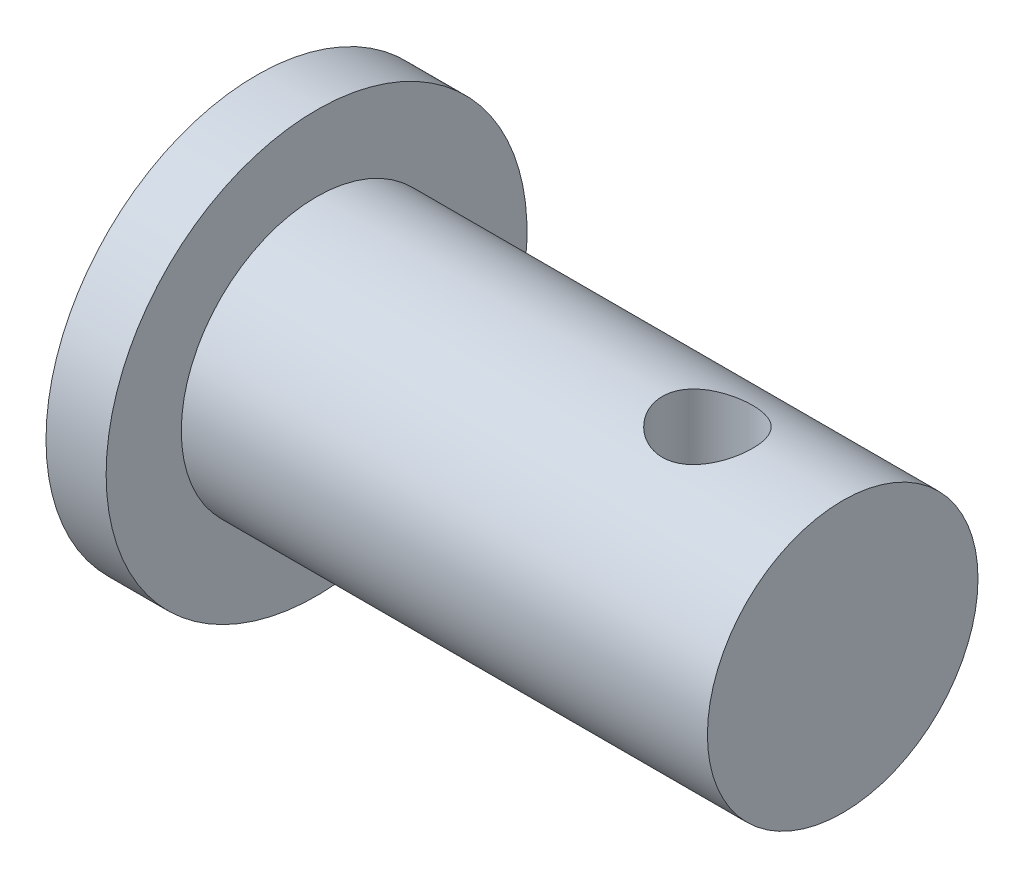
ISO-10303-21;
HEADER;
FILE_DESCRIPTION(('STEP AP214'),'2;1');
FILE_NAME('part.step','',(''),(''),'','','');
FILE_SCHEMA(('AUTOMOTIVE_DESIGN { 1 0 10303 214 1 1 1 1 }'));
ENDSEC;
DATA;
#1=APPLICATION_CONTEXT('core data for automotive mechanical design processes');
#2=APPLICATION_PROTOCOL_DEFINITION('international standard','automotive_design',2000,#1);
#3=PRODUCT_CONTEXT('',#1,'mechanical');
#4=PRODUCT('Part','Part','',(#3));
#5=PRODUCT_RELATED_PRODUCT_CATEGORY('part','',(#4));
#6=PRODUCT_DEFINITION_FORMATION('','',#4);
#7=PRODUCT_DEFINITION_CONTEXT('part definition',#1,'design');
#8=PRODUCT_DEFINITION('design','',#6,#7);
#9=PRODUCT_DEFINITION_SHAPE('','',#8);
#10=(LENGTH_UNIT() NAMED_UNIT(*) SI_UNIT(.MILLI.,.METRE.));
#11=(NAMED_UNIT(*) PLANE_ANGLE_UNIT() SI_UNIT($,.RADIAN.));
#12=(NAMED_UNIT(*) SI_UNIT($,.STERADIAN.) SOLID_ANGLE_UNIT());
#13=UNCERTAINTY_MEASURE_WITH_UNIT(LENGTH_MEASURE(1.E-05),#10,'distance_accuracy_value','');
#14=(GEOMETRIC_REPRESENTATION_CONTEXT(3) GLOBAL_UNCERTAINTY_ASSIGNED_CONTEXT((#13)) GLOBAL_UNIT_ASSIGNED_CONTEXT((#10,
#11,#12)) REPRESENTATION_CONTEXT('',''));
#15=CARTESIAN_POINT('',(0.,0.,0.));
#16=DIRECTION('',(0.,0.,1.));
#17=DIRECTION('',(1.,0.,0.));
#18=AXIS2_PLACEMENT_3D('',#15,#16,#17);
#19=CARTESIAN_POINT('',(19.5,0.,0.));
#20=DIRECTION('',(-1.,0.,0.));
#21=DIRECTION('',(0.,0.,1.));
#22=AXIS2_PLACEMENT_3D('',#19,#20,#21);
#23=CYLINDRICAL_SURFACE('',#22,4.5);
#24=CARTESIAN_POINT('',(15.,-4.24264068711929,1.5));
#25=CARTESIAN_POINT('',(15.0817022622541,-4.24264041795651,1.50000038692157));
#26=CARTESIAN_POINT('',(15.1634021997354,-4.24502653936286,1.49330217552828));
#27=CARTESIAN_POINT('',(15.3243816314914,-4.25426361121882,1.46677669753321));
#28=CARTESIAN_POINT('',(15.4036607248087,-4.26111529713283,1.4469472682526));
#29=CARTESIAN_POINT('',(15.5574403394959,-4.27842305533187,1.39493322852736));
#30=CARTESIAN_POINT('',(15.6319498941641,-4.28887205956983,1.36277283210487));
#31=CARTESIAN_POINT('',(15.7745400728219,-4.31218683015487,1.28709244266207));
#32=CARTESIAN_POINT('',(15.8426192738304,-4.32505312955418,1.24356994329028));
#33=CARTESIAN_POINT('',(15.9730799435075,-4.3523173411121,1.14457671966432));
#34=CARTESIAN_POINT('',(16.0351731430076,-4.36675342266966,1.08873651206688));
#35=CARTESIAN_POINT('',(16.149310201837,-4.39520797201504,0.967481500821592));
#36=CARTESIAN_POINT('',(16.2013524473736,-4.40922637243442,0.902065162578563));
#37=CARTESIAN_POINT('',(16.2952183459944,-4.43570800382699,0.761406761947514));
#38=CARTESIAN_POINT('',(16.3367399559269,-4.44812111552408,0.685952866836787));
#39=CARTESIAN_POINT('',(16.4063873776913,-4.46954380156474,0.528646834481211));
#40=CARTESIAN_POINT('',(16.4345167997654,-4.47855429304502,0.446796428530818));
#41=CARTESIAN_POINT('',(16.4756037819486,-4.49188613147861,0.282043226150241));
#42=CARTESIAN_POINT('',(16.4890551693855,-4.49635972166341,0.199276132279451));
#43=CARTESIAN_POINT('',(16.501974440041,-4.5006541232737,0.0325468122361353));
#44=CARTESIAN_POINT('',(16.5014459274786,-4.50047613394336,-0.0514151003158403));
#45=CARTESIAN_POINT('',(16.486733618151,-4.49559059428104,-0.214655272790726));
#46=CARTESIAN_POINT('',(16.4730862072882,-4.49106097132703,-0.293988072887501));
#47=CARTESIAN_POINT('',(16.4334105285293,-4.47820451009571,-0.449165158233241));
#48=CARTESIAN_POINT('',(16.4073814215304,-4.46987741446672,-0.525009206668763));
#49=CARTESIAN_POINT('',(16.3433680240408,-4.45013505439938,-0.67222871226302));
#50=CARTESIAN_POINT('',(16.3052310921798,-4.43868063786404,-0.743532331453497));
#51=CARTESIAN_POINT('',(16.2182104418274,-4.41387589557998,-0.878886488290754));
#52=CARTESIAN_POINT('',(16.16932373501,-4.40052504300777,-0.942935001577154));
#53=CARTESIAN_POINT('',(16.0594884098089,-4.37259287776335,-1.06515129982786));
#54=CARTESIAN_POINT('',(15.9980802632318,-4.35798322759,-1.12290023560133));
#55=CARTESIAN_POINT('',(15.866326911416,-4.32971002867667,-1.22741588939383));
#56=CARTESIAN_POINT('',(15.7959803314301,-4.31604662597175,-1.27418091490951));
#57=CARTESIAN_POINT('',(15.6470195615769,-4.29105787703296,-1.3559811825641));
#58=CARTESIAN_POINT('',(15.5683018029483,-4.27976864008232,-1.39083969547657));
#59=CARTESIAN_POINT('',(15.4056429086006,-4.26122476317448,-1.44666478994926));
#60=CARTESIAN_POINT('',(15.3217039781673,-4.25396843251835,-1.4676371936333));
#61=CARTESIAN_POINT('',(15.1550424668991,-4.24469454453105,-1.49424192313571));
#62=CARTESIAN_POINT('',(15.0724358628814,-4.24245540472709,-1.50052364325862));
#63=CARTESIAN_POINT('',(14.9073357763244,-4.24285008094201,-1.49940815836741));
#64=CARTESIAN_POINT('',(14.8248422759629,-4.24548301189152,-1.49201343784089));
#65=CARTESIAN_POINT('',(14.6652645514333,-4.25510427134068,-1.46433847732775));
#66=CARTESIAN_POINT('',(14.588091854774,-4.2619398816089,-1.44450959097083));
#67=CARTESIAN_POINT('',(14.4381845906409,-4.27902830506905,-1.39307079384089));
#68=CARTESIAN_POINT('',(14.3654508126137,-4.2892817240236,-1.36145879454519));
#69=CARTESIAN_POINT('',(14.2239293687296,-4.31245316393576,-1.28621151110835));
#70=CARTESIAN_POINT('',(14.1553400360373,-4.32544538498415,-1.24222667753773));
#71=CARTESIAN_POINT('',(14.0262809214244,-4.35248653096476,-1.14387844583635));
#72=CARTESIAN_POINT('',(13.9658135420082,-4.36653576665699,-1.08951198824818));
#73=CARTESIAN_POINT('',(13.851708023864,-4.39492557956765,-0.968837558850486));
#74=CARTESIAN_POINT('',(13.7985384149717,-4.40924765366843,-0.90208090581998));
#75=CARTESIAN_POINT('',(13.7041257864779,-4.43590277419665,-0.760240937100389));
#76=CARTESIAN_POINT('',(13.6628823432564,-4.44823589126543,-0.685157917296831));
#77=CARTESIAN_POINT('',(13.5938698427074,-4.46946608715904,-0.529169793648445));
#78=CARTESIAN_POINT('',(13.5660130842779,-4.47838545006797,-0.448306684981796));
#79=CARTESIAN_POINT('',(13.5244083869098,-4.49187916256662,-0.282687698769026));
#80=CARTESIAN_POINT('',(13.5106553551792,-4.49645508051028,-0.197933237930836));
#81=CARTESIAN_POINT('',(13.4981068835915,-4.50062794854384,-0.0312230037900626));
#82=CARTESIAN_POINT('',(13.4986388191014,-4.50044880134159,0.0506770858800268));
#83=CARTESIAN_POINT('',(13.5129859622196,-4.49568294779097,0.21316671750026));
#84=CARTESIAN_POINT('',(13.5268000922292,-4.49109659900364,0.293756365228584));
#85=CARTESIAN_POINT('',(13.5668733518639,-4.47811372431619,0.450063179148087));
#86=CARTESIAN_POINT('',(13.5929313230294,-4.46977887541723,0.525837406369183));
#87=CARTESIAN_POINT('',(13.6565662966457,-4.45015741056742,0.671967526409693));
#88=CARTESIAN_POINT('',(13.6941453827955,-4.43887026072025,0.742322436213648));
#89=CARTESIAN_POINT('',(13.781354268153,-4.41398803241821,0.878451024463177));
#90=CARTESIAN_POINT('',(13.8313780280725,-4.4003230873789,0.943959377336411));
#91=CARTESIAN_POINT('',(13.9413860867343,-4.37239483187819,1.06587153940864));
#92=CARTESIAN_POINT('',(14.0013735633941,-4.35813133159646,1.12227243243689));
#93=CARTESIAN_POINT('',(14.1324140333804,-4.32994919738397,1.22661271324968));
#94=CARTESIAN_POINT('',(14.203808266465,-4.31606591982946,1.27413444899685));
#95=CARTESIAN_POINT('',(14.3540016403542,-4.29090289984523,1.35647151495167));
#96=CARTESIAN_POINT('',(14.4327988395445,-4.27962247741874,1.39129016522921));
#97=CARTESIAN_POINT('',(14.5919427360234,-4.26152001309772,1.44576574230625));
#98=CARTESIAN_POINT('',(14.672058395288,-4.25451949285773,1.46603686372428));
#99=CARTESIAN_POINT('',(14.8347840757001,-4.24508075309277,1.4931514802239));
#100=CARTESIAN_POINT('',(14.9173932261161,-4.24264095926192,1.49999960879489));
#101=CARTESIAN_POINT('',(15.,-4.24264068711929,1.5));
#102=B_SPLINE_CURVE_WITH_KNOTS('',3,(#24,#25,#26,#27,#28,#29,#30,#31,#32,#33,#34,#35,#36,#37,
#38,#39,#40,#41,#42,#43,#44,#45,#46,#47,#48,#49,#50,#51,#52,#53,#54,#55,#56,#57,#58,#59,#60,#61,
#62,#63,#64,#65,#66,#67,#68,#69,#70,#71,#72,#73,#74,#75,#76,#77,#78,#79,#80,#81,#82,#83,#84,#85,
#86,#87,#88,#89,#90,#91,#92,#93,#94,#95,#96,#97,#98,#99,#100,#101),.UNSPECIFIED.,.T.,.F.,(4,2,2,
2,2,2,2,2,2,2,2,2,2,2,2,2,2,2,2,2,2,2,2,2,2,2,2,2,2,2,2,2,2,2,2,2,2,2,4),(0.,0.244800877199033,
0.489642082522746,0.73400494125124,0.978421749278162,1.23152006141352,1.48465897757982,
1.74440259215486,2.00407614580184,2.25471478147401,2.50528879953491,2.74603507238354,
2.98679766283855,3.23072482290502,3.47471987811033,3.73020261545876,3.98572469418159,
4.24488959763007,4.50394577031476,4.75131437043211,4.99863803752403,5.23746593649716,
5.47633618716971,5.72278286600124,5.96930228489743,6.22768212253191,6.4860527813285,
6.74270686782829,6.99926824502787,7.24377127013005,7.48825446011223,7.72885434057197,
7.96949776141416,8.21903279277503,8.46864756645499,8.72803354100769,8.98735167396852,
9.23494818240588,9.48245920782248),.UNSPECIFIED.);
#103=CARTESIAN_POINT('',(15.,-4.24264068711929,1.5));
#104=VERTEX_POINT('',#103);
#105=EDGE_CURVE('E50',#104,#104,#102,.T.);
#106=ORIENTED_EDGE('',*,*,#105,.T.);
#107=EDGE_LOOP('',(#106));
#108=FACE_BOUND('',#107,.T.);
#109=CARTESIAN_POINT('',(15.,4.24264068711929,1.5));
#110=CARTESIAN_POINT('',(14.9182977377459,4.24264041795651,1.50000038692157));
#111=CARTESIAN_POINT('',(14.8365978002646,4.24502653936286,1.49330217552828));
#112=CARTESIAN_POINT('',(14.6756183685086,4.25426361121882,1.46677669753321));
#113=CARTESIAN_POINT('',(14.5963392751913,4.26111529713283,1.4469472682526));
#114=CARTESIAN_POINT('',(14.4425596605041,4.27842305533187,1.39493322852736));
#115=CARTESIAN_POINT('',(14.3680501058359,4.28887205956983,1.36277283210487));
#116=CARTESIAN_POINT('',(14.2254599271781,4.31218683015487,1.28709244266207));
#117=CARTESIAN_POINT('',(14.1573807261696,4.32505312955419,1.24356994329027));
#118=CARTESIAN_POINT('',(14.0269200564925,4.3523173411121,1.14457671966432));
#119=CARTESIAN_POINT('',(13.9648268569924,4.36675342266966,1.08873651206688));
#120=CARTESIAN_POINT('',(13.850689798163,4.39520797201505,0.967481500821592));
#121=CARTESIAN_POINT('',(13.7986475526264,4.40922637243442,0.902065162578563));
#122=CARTESIAN_POINT('',(13.7047816540056,4.43570800382699,0.761406761947515));
#123=CARTESIAN_POINT('',(13.6632600440731,4.44812111552408,0.685952866836787));
#124=CARTESIAN_POINT('',(13.5936126223087,4.46954380156474,0.52864683448121));
#125=CARTESIAN_POINT('',(13.5654832002346,4.47855429304502,0.446796428530818));
#126=CARTESIAN_POINT('',(13.5243962180514,4.49188613147861,0.282043226150241));
#127=CARTESIAN_POINT('',(13.5109448306145,4.49635972166341,0.199276132279451));
#128=CARTESIAN_POINT('',(13.498025559959,4.5006541232737,0.0325468122361353));
#129=CARTESIAN_POINT('',(13.4985540725214,4.50047613394336,-0.0514151003158401));
#130=CARTESIAN_POINT('',(13.513266381849,4.49559059428104,-0.214655272790727));
#131=CARTESIAN_POINT('',(13.5269137927118,4.49106097132703,-0.293988072887502));
#132=CARTESIAN_POINT('',(13.5665894714707,4.47820451009571,-0.449165158233242));
#133=CARTESIAN_POINT('',(13.5926185784696,4.46987741446672,-0.525009206668764));
#134=CARTESIAN_POINT('',(13.6566319759592,4.45013505439938,-0.672228712263021));
#135=CARTESIAN_POINT('',(13.6947689078202,4.43868063786404,-0.743532331453498));
#136=CARTESIAN_POINT('',(13.7817895581726,4.41387589557997,-0.878886488290755));
#137=CARTESIAN_POINT('',(13.83067626499,4.40052504300777,-0.942935001577155));
#138=CARTESIAN_POINT('',(13.9405115901911,4.37259287776335,-1.06515129982786));
#139=CARTESIAN_POINT('',(14.0019197367682,4.35798322759,-1.12290023560133));
#140=CARTESIAN_POINT('',(14.133673088584,4.32971002867667,-1.22741588939383));
#141=CARTESIAN_POINT('',(14.2040196685699,4.31604662597175,-1.27418091490951));
#142=CARTESIAN_POINT('',(14.3529804384231,4.29105787703296,-1.3559811825641));
#143=CARTESIAN_POINT('',(14.4316981970517,4.27976864008232,-1.39083969547657));
#144=CARTESIAN_POINT('',(14.5943570913994,4.26122476317448,-1.44666478994926));
#145=CARTESIAN_POINT('',(14.6782960218327,4.25396843251835,-1.4676371936333));
#146=CARTESIAN_POINT('',(14.8449575331009,4.24469454453105,-1.49424192313571));
#147=CARTESIAN_POINT('',(14.9275641371186,4.24245540472709,-1.50052364325862));
#148=CARTESIAN_POINT('',(15.0926642236756,4.24285008094201,-1.49940815836741));
#149=CARTESIAN_POINT('',(15.1751577240371,4.24548301189152,-1.49201343784089));
#150=CARTESIAN_POINT('',(15.3347354485667,4.25510427134068,-1.46433847732775));
#151=CARTESIAN_POINT('',(15.411908145226,4.2619398816089,-1.44450959097083));
#152=CARTESIAN_POINT('',(15.5618154093591,4.27902830506905,-1.39307079384089));
#153=CARTESIAN_POINT('',(15.6345491873863,4.2892817240236,-1.36145879454519));
#154=CARTESIAN_POINT('',(15.7760706312704,4.31245316393576,-1.28621151110835));
#155=CARTESIAN_POINT('',(15.8446599639627,4.32544538498415,-1.24222667753773));
#156=CARTESIAN_POINT('',(15.9737190785756,4.35248653096476,-1.14387844583635));
#157=CARTESIAN_POINT('',(16.0341864579918,4.36653576665699,-1.08951198824818));
#158=CARTESIAN_POINT('',(16.1482919761359,4.39492557956765,-0.968837558850486));
#159=CARTESIAN_POINT('',(16.2014615850283,4.40924765366843,-0.902080905819979));
#160=CARTESIAN_POINT('',(16.2958742135221,4.43590277419665,-0.760240937100388));
#161=CARTESIAN_POINT('',(16.3371176567436,4.44823589126543,-0.68515791729683));
#162=CARTESIAN_POINT('',(16.4061301572926,4.46946608715904,-0.529169793648443));
#163=CARTESIAN_POINT('',(16.4339869157221,4.47838545006797,-0.448306684981795));
#164=CARTESIAN_POINT('',(16.4755916130902,4.49187916256662,-0.282687698769025));
#165=CARTESIAN_POINT('',(16.4893446448208,4.49645508051028,-0.197933237930834));
#166=CARTESIAN_POINT('',(16.5018931164085,4.50062794854384,-0.0312230037900615));
#167=CARTESIAN_POINT('',(16.5013611808986,4.50044880134159,0.0506770858800275));
#168=CARTESIAN_POINT('',(16.4870140377804,4.49568294779097,0.21316671750026));
#169=CARTESIAN_POINT('',(16.4731999077708,4.49109659900364,0.293756365228585));
#170=CARTESIAN_POINT('',(16.4331266481361,4.47811372431619,0.450063179148088));
#171=CARTESIAN_POINT('',(16.4070686769706,4.46977887541723,0.525837406369184));
#172=CARTESIAN_POINT('',(16.3434337033543,4.45015741056742,0.671967526409693));
#173=CARTESIAN_POINT('',(16.3058546172045,4.43887026072025,0.742322436213648));
#174=CARTESIAN_POINT('',(16.218645731847,4.41398803241821,0.878451024463178));
#175=CARTESIAN_POINT('',(16.1686219719275,4.4003230873789,0.943959377336412));
#176=CARTESIAN_POINT('',(16.0586139132657,4.37239483187819,1.06587153940864));
#177=CARTESIAN_POINT('',(15.9986264366059,4.35813133159646,1.12227243243689));
#178=CARTESIAN_POINT('',(15.8675859666196,4.32994919738397,1.22661271324968));
#179=CARTESIAN_POINT('',(15.796191733535,4.31606591982946,1.27413444899685));
#180=CARTESIAN_POINT('',(15.6459983596458,4.29090289984523,1.35647151495167));
#181=CARTESIAN_POINT('',(15.5672011604555,4.27962247741874,1.39129016522921));
#182=CARTESIAN_POINT('',(15.4080572639766,4.26152001309772,1.44576574230625));
#183=CARTESIAN_POINT('',(15.327941604712,4.25451949285773,1.46603686372428));
#184=CARTESIAN_POINT('',(15.1652159242999,4.24508075309277,1.4931514802239));
#185=CARTESIAN_POINT('',(15.0826067738839,4.24264095926192,1.49999960879489));
#186=CARTESIAN_POINT('',(15.,4.24264068711929,1.5));
#187=B_SPLINE_CURVE_WITH_KNOTS('',3,(#109,#110,#111,#112,#113,#114,#115,#116,#117,#118,#119,
#120,#121,#122,#123,#124,#125,#126,#127,#128,#129,#130,#131,#132,#133,#134,#135,#136,#137,#138,
#139,#140,#141,#142,#143,#144,#145,#146,#147,#148,#149,#150,#151,#152,#153,#154,#155,#156,#157,
#158,#159,#160,#161,#162,#163,#164,#165,#166,#167,#168,#169,#170,#171,#172,#173,#174,#175,#176,
#177,#178,#179,#180,#181,#182,#183,#184,#185,#186),.UNSPECIFIED.,.T.,.F.,(4,2,2,2,2,2,2,2,2,2,2,
2,2,2,2,2,2,2,2,2,2,2,2,2,2,2,2,2,2,2,2,2,2,2,2,2,2,2,4),(0.,0.244800877199035,
0.489642082522746,0.734004941251243,0.978421749278165,1.23152006141352,1.48465897757982,
1.74440259215486,2.00407614580184,2.25471478147401,2.50528879953491,2.74603507238354,
2.98679766283855,3.23072482290503,3.47471987811033,3.73020261545876,3.98572469418159,
4.24488959763007,4.50394577031476,4.75131437043211,4.99863803752403,5.23746593649716,
5.47633618716971,5.72278286600124,5.96930228489743,6.22768212253191,6.48605278132851,
6.74270686782829,6.99926824502787,7.24377127013005,7.48825446011224,7.72885434057197,
7.96949776141416,8.21903279277503,8.46864756645499,8.72803354100769,8.98735167396852,
9.23494818240588,9.48245920782248),.UNSPECIFIED.);
#188=CARTESIAN_POINT('',(15.,4.24264068711929,1.5));
#189=VERTEX_POINT('',#188);
#190=EDGE_CURVE('E65',#189,#189,#187,.T.);
#191=ORIENTED_EDGE('',*,*,#190,.T.);
#192=EDGE_LOOP('',(#191));
#193=FACE_BOUND('',#192,.T.);
#194=CARTESIAN_POINT('',(19.5,0.,0.));
#195=DIRECTION('',(1.,0.,0.));
#196=DIRECTION('',(0.,0.,-1.));
#197=AXIS2_PLACEMENT_3D('',#194,#195,#196);
#198=CIRCLE('',#197,4.5);
#199=CARTESIAN_POINT('',(19.5,0.,-4.5));
#200=VERTEX_POINT('',#199);
#201=EDGE_CURVE('E57',#200,#200,#198,.T.);
#202=ORIENTED_EDGE('',*,*,#201,.F.);
#203=EDGE_LOOP('',(#202));
#204=FACE_BOUND('',#203,.T.);
#205=CARTESIAN_POINT('',(2.,0.,0.));
#206=DIRECTION('',(-1.,0.,0.));
#207=DIRECTION('',(0.,0.,1.));
#208=AXIS2_PLACEMENT_3D('',#205,#206,#207);
#209=CIRCLE('',#208,4.5);
#210=CARTESIAN_POINT('',(2.,0.,4.5));
#211=VERTEX_POINT('',#210);
#212=EDGE_CURVE('E12',#211,#211,#209,.T.);
#213=ORIENTED_EDGE('',*,*,#212,.F.);
#214=EDGE_LOOP('',(#213));
#215=FACE_BOUND('',#214,.T.);
#216=ADVANCED_FACE('F46',(#108,#193,#204,#215),#23,.T.);
#217=CARTESIAN_POINT('',(19.5,0.,0.));
#218=DIRECTION('',(1.,0.,0.));
#219=DIRECTION('',(0.,0.,-1.));
#220=AXIS2_PLACEMENT_3D('',#217,#218,#219);
#221=PLANE('',#220);
#222=ORIENTED_EDGE('',*,*,#201,.T.);
#223=EDGE_LOOP('',(#222));
#224=FACE_BOUND('',#223,.T.);
#225=ADVANCED_FACE('F82',(#224),#221,.T.);
#226=CARTESIAN_POINT('',(2.,0.,0.));
#227=DIRECTION('',(-1.,0.,0.));
#228=DIRECTION('',(0.,0.,1.));
#229=AXIS2_PLACEMENT_3D('',#226,#227,#228);
#230=CYLINDRICAL_SURFACE('',#229,7.);
#231=CARTESIAN_POINT('',(2.,0.,0.));
#232=DIRECTION('',(-1.,0.,0.));
#233=DIRECTION('',(0.,0.,1.));
#234=AXIS2_PLACEMENT_3D('',#231,#232,#233);
#235=CIRCLE('',#234,7.);
#236=CARTESIAN_POINT('',(2.,0.,7.));
#237=VERTEX_POINT('',#236);
#238=EDGE_CURVE('E62',#237,#237,#235,.T.);
#239=ORIENTED_EDGE('',*,*,#238,.T.);
#240=EDGE_LOOP('',(#239));
#241=FACE_BOUND('',#240,.T.);
#242=CARTESIAN_POINT('',(0.,0.,0.));
#243=DIRECTION('',(-1.,0.,0.));
#244=DIRECTION('',(0.,0.,1.));
#245=AXIS2_PLACEMENT_3D('',#242,#243,#244);
#246=CIRCLE('',#245,7.);
#247=CARTESIAN_POINT('',(0.,0.,7.));
#248=VERTEX_POINT('',#247);
#249=EDGE_CURVE('E103',#248,#248,#246,.T.);
#250=ORIENTED_EDGE('',*,*,#249,.F.);
#251=EDGE_LOOP('',(#250));
#252=FACE_BOUND('',#251,.T.);
#253=ADVANCED_FACE('F79',(#241,#252),#230,.T.);
#254=CARTESIAN_POINT('',(2.,0.,0.));
#255=DIRECTION('',(-1.,0.,0.));
#256=DIRECTION('',(0.,0.,1.));
#257=AXIS2_PLACEMENT_3D('',#254,#255,#256);
#258=PLANE('',#257);
#259=ORIENTED_EDGE('',*,*,#212,.T.);
#260=EDGE_LOOP('',(#259));
#261=FACE_BOUND('',#260,.T.);
#262=ORIENTED_EDGE('',*,*,#238,.F.);
#263=EDGE_LOOP('',(#262));
#264=FACE_BOUND('',#263,.T.);
#265=ADVANCED_FACE('F75',(#261,#264),#258,.F.);
#266=CARTESIAN_POINT('',(0.,0.,0.));
#267=DIRECTION('',(1.,0.,0.));
#268=DIRECTION('',(0.,0.,-1.));
#269=AXIS2_PLACEMENT_3D('',#266,#267,#268);
#270=PLANE('',#269);
#271=ORIENTED_EDGE('',*,*,#249,.T.);
#272=EDGE_LOOP('',(#271));
#273=FACE_BOUND('',#272,.T.);
#274=ADVANCED_FACE('F73',(#273),#270,.F.);
#275=CARTESIAN_POINT('',(15.,-7.,0.));
#276=DIRECTION('',(0.,1.,0.));
#277=DIRECTION('',(0.,0.,1.));
#278=AXIS2_PLACEMENT_3D('',#275,#276,#277);
#279=CYLINDRICAL_SURFACE('',#278,1.5);
#280=ORIENTED_EDGE('',*,*,#190,.F.);
#281=EDGE_LOOP('',(#280));
#282=FACE_BOUND('',#281,.T.);
#283=ORIENTED_EDGE('',*,*,#105,.F.);
#284=EDGE_LOOP('',(#283));
#285=FACE_BOUND('',#284,.T.);
#286=ADVANCED_FACE('F69',(#282,#285),#279,.F.);
#287=CLOSED_SHELL('',(#216,#225,#253,#265,#274,#286));
#288=MANIFOLD_SOLID_BREP('B2',#287);
#289=ADVANCED_BREP_SHAPE_REPRESENTATION('',(#18,#288),#14);
#290=SHAPE_DEFINITION_REPRESENTATION(#9,#289);
ENDSEC;
END-ISO-10303-21;
